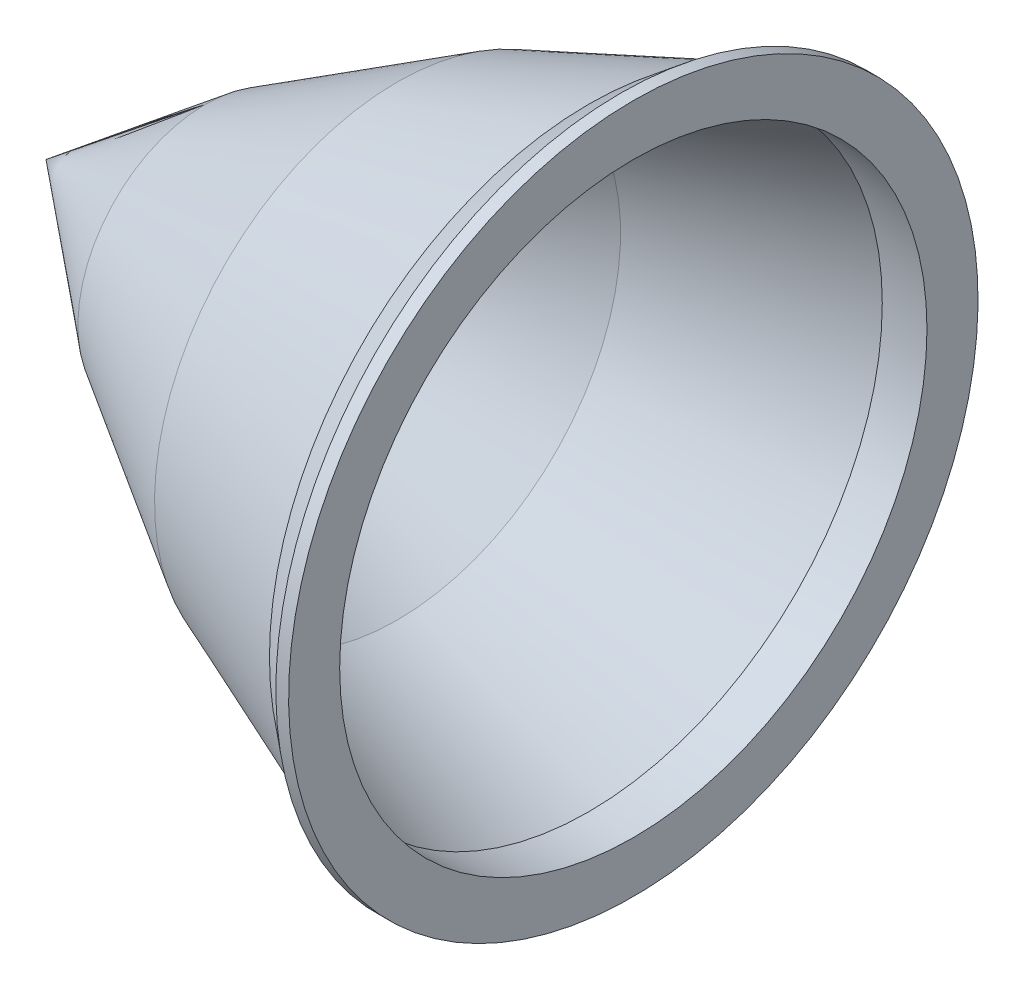
ISO-10303-21;
HEADER;
FILE_DESCRIPTION(('STEP AP214'),'2;1');
FILE_NAME('part.step','',(''),(''),'','','');
FILE_SCHEMA(('AUTOMOTIVE_DESIGN { 1 0 10303 214 1 1 1 1 }'));
ENDSEC;
DATA;
#1=APPLICATION_CONTEXT('core data for automotive mechanical design processes');
#2=APPLICATION_PROTOCOL_DEFINITION('international standard','automotive_design',2000,#1);
#3=PRODUCT_CONTEXT('',#1,'mechanical');
#4=PRODUCT('Part','Part','',(#3));
#5=PRODUCT_RELATED_PRODUCT_CATEGORY('part','',(#4));
#6=PRODUCT_DEFINITION_FORMATION('','',#4);
#7=PRODUCT_DEFINITION_CONTEXT('part definition',#1,'design');
#8=PRODUCT_DEFINITION('design','',#6,#7);
#9=PRODUCT_DEFINITION_SHAPE('','',#8);
#10=(LENGTH_UNIT() NAMED_UNIT(*) SI_UNIT(.MILLI.,.METRE.));
#11=(NAMED_UNIT(*) PLANE_ANGLE_UNIT() SI_UNIT($,.RADIAN.));
#12=(NAMED_UNIT(*) SI_UNIT($,.STERADIAN.) SOLID_ANGLE_UNIT());
#13=UNCERTAINTY_MEASURE_WITH_UNIT(LENGTH_MEASURE(1.E-05),#10,'distance_accuracy_value','');
#14=(GEOMETRIC_REPRESENTATION_CONTEXT(3) GLOBAL_UNCERTAINTY_ASSIGNED_CONTEXT((#13)) GLOBAL_UNIT_ASSIGNED_CONTEXT((#10,
#11,#12)) REPRESENTATION_CONTEXT('',''));
#15=CARTESIAN_POINT('',(0.,0.,0.));
#16=DIRECTION('',(0.,0.,1.));
#17=DIRECTION('',(1.,0.,0.));
#18=AXIS2_PLACEMENT_3D('',#15,#16,#17);
#19=CARTESIAN_POINT('',(50.,0.,0.));
#20=DIRECTION('',(1.,0.,0.));
#21=DIRECTION('',(0.,0.,-1.));
#22=AXIS2_PLACEMENT_3D('',#19,#20,#21);
#23=CONICAL_SURFACE('',#22,0.,0.704494064242218);
#24=CARTESIAN_POINT('',(250.,0.,0.));
#25=DIRECTION('',(-1.,0.,0.));
#26=DIRECTION('',(0.,0.,1.));
#27=AXIS2_PLACEMENT_3D('',#24,#25,#26);
#28=CIRCLE('',#27,170.);
#29=CARTESIAN_POINT('',(250.,170.,-1.22052963014615E-06));
#30=VERTEX_POINT('',#29);
#31=CARTESIAN_POINT('',(250.,170.,0.));
#32=VERTEX_POINT('',#31);
#33=EDGE_CURVE('E11',#30,#32,#28,.T.);
#34=ORIENTED_EDGE('',*,*,#33,.F.);
#35=DIRECTION('',(0.761939317759459,0.64764842009554,-4.64984756849381E-09));
#36=VECTOR('',#35,1.);
#37=CARTESIAN_POINT('',(250.,170.,-1.22052963014615E-06));
#38=LINE('',#37,#36);
#39=CARTESIAN_POINT('',(50.,0.,0.));
#40=VERTEX_POINT('',#39);
#41=EDGE_CURVE('E130',#40,#30,#38,.T.);
#42=ORIENTED_EDGE('',*,*,#41,.F.);
#43=DIRECTION('',(0.761939317759459,0.64764842009554,0.));
#44=VECTOR('',#43,1.);
#45=CARTESIAN_POINT('',(250.,170.,0.));
#46=LINE('',#45,#44);
#47=EDGE_CURVE('E128',#40,#32,#46,.T.);
#48=ORIENTED_EDGE('',*,*,#47,.T.);
#49=EDGE_LOOP('',(#34,#42,#48));
#50=FACE_BOUND('',#49,.T.);
#51=ADVANCED_FACE('F39',(#50),#23,.F.);
#52=CARTESIAN_POINT('',(250.,0.,0.));
#53=DIRECTION('',(1.,0.,0.));
#54=DIRECTION('',(0.,0.,-1.));
#55=AXIS2_PLACEMENT_3D('',#52,#53,#54);
#56=CONICAL_SURFACE('',#55,170.,0.540419500270584);
#57=CARTESIAN_POINT('',(550.,0.,0.));
#58=DIRECTION('',(-1.,0.,0.));
#59=DIRECTION('',(0.,0.,1.));
#60=AXIS2_PLACEMENT_3D('',#57,#58,#59);
#61=CIRCLE('',#60,350.);
#62=CARTESIAN_POINT('',(550.,350.,-2.51285512088913E-06));
#63=VERTEX_POINT('',#62);
#64=CARTESIAN_POINT('',(550.,350.,0.));
#65=VERTEX_POINT('',#64);
#66=EDGE_CURVE('E46',#63,#65,#61,.T.);
#67=ORIENTED_EDGE('',*,*,#66,.F.);
#68=DIRECTION('',(0.857492925712544,0.514495755427526,-3.69386655343366E-09));
#69=VECTOR('',#68,1.);
#70=CARTESIAN_POINT('',(550.,350.,-2.51285512088913E-06));
#71=LINE('',#70,#69);
#72=EDGE_CURVE('E122',#30,#63,#71,.T.);
#73=ORIENTED_EDGE('',*,*,#72,.F.);
#74=ORIENTED_EDGE('',*,*,#33,.T.);
#75=DIRECTION('',(0.857492925712544,0.514495755427526,0.));
#76=VECTOR('',#75,1.);
#77=CARTESIAN_POINT('',(550.,350.,0.));
#78=LINE('',#77,#76);
#79=EDGE_CURVE('E118',#32,#65,#78,.T.);
#80=ORIENTED_EDGE('',*,*,#79,.T.);
#81=EDGE_LOOP('',(#67,#73,#74,#80));
#82=FACE_BOUND('',#81,.T.);
#83=ADVANCED_FACE('F117',(#82),#56,.F.);
#84=CARTESIAN_POINT('',(550.,0.,0.));
#85=DIRECTION('',(1.,0.,0.));
#86=DIRECTION('',(0.,0.,-1.));
#87=AXIS2_PLACEMENT_3D('',#84,#85,#86);
#88=CONICAL_SURFACE('',#87,350.,0.351444794003552);
#89=CARTESIAN_POINT('',(850.,0.,0.));
#90=DIRECTION('',(-1.,0.,0.));
#91=DIRECTION('',(0.,0.,1.));
#92=AXIS2_PLACEMENT_3D('',#89,#90,#91);
#93=CIRCLE('',#92,460.);
#94=CARTESIAN_POINT('',(850.,460.,-3.30260958745428E-06));
#95=VERTEX_POINT('',#94);
#96=CARTESIAN_POINT('',(850.,460.,0.));
#97=VERTEX_POINT('',#96);
#98=EDGE_CURVE('E191',#95,#97,#93,.T.);
#99=ORIENTED_EDGE('',*,*,#98,.F.);
#100=DIRECTION('',(0.938876315886608,0.344254649158423,-2.47160588007895E-09));
#101=VECTOR('',#100,1.);
#102=CARTESIAN_POINT('',(850.,460.,-3.30260958745428E-06));
#103=LINE('',#102,#101);
#104=EDGE_CURVE('E158',#63,#95,#103,.T.);
#105=ORIENTED_EDGE('',*,*,#104,.F.);
#106=ORIENTED_EDGE('',*,*,#66,.T.);
#107=DIRECTION('',(0.938876315886608,0.344254649158423,0.));
#108=VECTOR('',#107,1.);
#109=CARTESIAN_POINT('',(850.,460.,0.));
#110=LINE('',#109,#108);
#111=EDGE_CURVE('E132',#65,#97,#110,.T.);
#112=ORIENTED_EDGE('',*,*,#111,.T.);
#113=EDGE_LOOP('',(#99,#105,#106,#112));
#114=FACE_BOUND('',#113,.T.);
#115=ADVANCED_FACE('F197',(#114),#88,.F.);
#116=CARTESIAN_POINT('',(0.,0.,0.));
#117=DIRECTION('',(-1.,0.,0.));
#118=DIRECTION('',(0.,0.,1.));
#119=AXIS2_PLACEMENT_3D('',#116,#117,#118);
#120=CYLINDRICAL_SURFACE('',#119,460.);
#121=CARTESIAN_POINT('',(920.,0.,0.));
#122=DIRECTION('',(-1.,0.,0.));
#123=DIRECTION('',(0.,0.,1.));
#124=AXIS2_PLACEMENT_3D('',#121,#122,#123);
#125=CIRCLE('',#124,460.);
#126=CARTESIAN_POINT('',(920.,460.,-3.30260958745428E-06));
#127=VERTEX_POINT('',#126);
#128=CARTESIAN_POINT('',(920.,460.,0.));
#129=VERTEX_POINT('',#128);
#130=EDGE_CURVE('E195',#127,#129,#125,.T.);
#131=ORIENTED_EDGE('',*,*,#130,.F.);
#132=DIRECTION('',(1.,0.,0.));
#133=VECTOR('',#132,1.);
#134=CARTESIAN_POINT('',(920.,460.,-3.30260958745428E-06));
#135=LINE('',#134,#133);
#136=EDGE_CURVE('E164',#95,#127,#135,.T.);
#137=ORIENTED_EDGE('',*,*,#136,.F.);
#138=ORIENTED_EDGE('',*,*,#98,.T.);
#139=DIRECTION('',(1.,0.,0.));
#140=VECTOR('',#139,1.);
#141=CARTESIAN_POINT('',(920.,460.,0.));
#142=LINE('',#141,#140);
#143=EDGE_CURVE('E136',#97,#129,#142,.T.);
#144=ORIENTED_EDGE('',*,*,#143,.T.);
#145=EDGE_LOOP('',(#131,#137,#138,#144));
#146=FACE_BOUND('',#145,.T.);
#147=ADVANCED_FACE('F217',(#146),#120,.F.);
#148=CARTESIAN_POINT('',(920.,540.,-3.87697647222894E-06));
#149=DIRECTION('',(-1.,0.,0.));
#150=DIRECTION('',(0.,0.,1.));
#151=AXIS2_PLACEMENT_3D('',#148,#149,#150);
#152=PLANE('',#151);
#153=CARTESIAN_POINT('',(920.,0.,0.));
#154=DIRECTION('',(-1.,0.,0.));
#155=DIRECTION('',(0.,0.,1.));
#156=AXIS2_PLACEMENT_3D('',#153,#154,#155);
#157=CIRCLE('',#156,540.);
#158=CARTESIAN_POINT('',(920.,540.,-3.87697647222894E-06));
#159=VERTEX_POINT('',#158);
#160=CARTESIAN_POINT('',(920.,540.,0.));
#161=VERTEX_POINT('',#160);
#162=EDGE_CURVE('E189',#159,#161,#157,.T.);
#163=ORIENTED_EDGE('',*,*,#162,.F.);
#164=DIRECTION('',(0.,1.,-7.17958605968322E-09));
#165=VECTOR('',#164,1.);
#166=CARTESIAN_POINT('',(920.,540.,-3.87697647222894E-06));
#167=LINE('',#166,#165);
#168=EDGE_CURVE('E168',#127,#159,#167,.T.);
#169=ORIENTED_EDGE('',*,*,#168,.F.);
#170=ORIENTED_EDGE('',*,*,#130,.T.);
#171=DIRECTION('',(0.,1.,0.));
#172=VECTOR('',#171,1.);
#173=CARTESIAN_POINT('',(920.,540.,0.));
#174=LINE('',#173,#172);
#175=EDGE_CURVE('E141',#129,#161,#174,.T.);
#176=ORIENTED_EDGE('',*,*,#175,.T.);
#177=EDGE_LOOP('',(#163,#169,#170,#176));
#178=FACE_BOUND('',#177,.T.);
#179=ADVANCED_FACE('F216',(#178),#152,.F.);
#180=CARTESIAN_POINT('',(0.,0.,0.));
#181=DIRECTION('',(-1.,0.,0.));
#182=DIRECTION('',(0.,0.,1.));
#183=AXIS2_PLACEMENT_3D('',#180,#181,#182);
#184=CYLINDRICAL_SURFACE('',#183,540.);
#185=CARTESIAN_POINT('',(900.,0.,0.));
#186=DIRECTION('',(-1.,0.,0.));
#187=DIRECTION('',(0.,0.,1.));
#188=AXIS2_PLACEMENT_3D('',#185,#186,#187);
#189=CIRCLE('',#188,540.);
#190=CARTESIAN_POINT('',(900.,540.,-3.87697647222894E-06));
#191=VERTEX_POINT('',#190);
#192=CARTESIAN_POINT('',(900.,540.,0.));
#193=VERTEX_POINT('',#192);
#194=EDGE_CURVE('E187',#191,#193,#189,.T.);
#195=ORIENTED_EDGE('',*,*,#194,.F.);
#196=DIRECTION('',(-1.,0.,0.));
#197=VECTOR('',#196,1.);
#198=CARTESIAN_POINT('',(900.,540.,-3.87697647222894E-06));
#199=LINE('',#198,#197);
#200=EDGE_CURVE('E170',#159,#191,#199,.T.);
#201=ORIENTED_EDGE('',*,*,#200,.F.);
#202=ORIENTED_EDGE('',*,*,#162,.T.);
#203=DIRECTION('',(-1.,0.,0.));
#204=VECTOR('',#203,1.);
#205=CARTESIAN_POINT('',(900.,540.,0.));
#206=LINE('',#205,#204);
#207=EDGE_CURVE('E143',#161,#193,#206,.T.);
#208=ORIENTED_EDGE('',*,*,#207,.T.);
#209=EDGE_LOOP('',(#195,#201,#202,#208));
#210=FACE_BOUND('',#209,.T.);
#211=ADVANCED_FACE('F215',(#210),#184,.T.);
#212=CARTESIAN_POINT('',(900.,0.,0.));
#213=DIRECTION('',(1.,0.,0.));
#214=DIRECTION('',(0.,0.,-1.));
#215=AXIS2_PLACEMENT_3D('',#212,#213,#214);
#216=CONICAL_SURFACE('',#215,540.,0.674740942223553);
#217=CARTESIAN_POINT('',(850.,0.,0.));
#218=DIRECTION('',(-1.,0.,0.));
#219=DIRECTION('',(0.,0.,1.));
#220=AXIS2_PLACEMENT_3D('',#217,#218,#219);
#221=CIRCLE('',#220,500.);
#222=CARTESIAN_POINT('',(850.,500.,-3.58979302984161E-06));
#223=VERTEX_POINT('',#222);
#224=CARTESIAN_POINT('',(850.,500.,0.));
#225=VERTEX_POINT('',#224);
#226=EDGE_CURVE('E186',#223,#225,#221,.T.);
#227=ORIENTED_EDGE('',*,*,#226,.F.);
#228=DIRECTION('',(-0.78086880944303,-0.624695047554424,4.48505185497489E-09));
#229=VECTOR('',#228,1.);
#230=CARTESIAN_POINT('',(850.,500.,-3.58979302984161E-06));
#231=LINE('',#230,#229);
#232=EDGE_CURVE('E175',#191,#223,#231,.T.);
#233=ORIENTED_EDGE('',*,*,#232,.F.);
#234=ORIENTED_EDGE('',*,*,#194,.T.);
#235=DIRECTION('',(-0.78086880944303,-0.624695047554424,0.));
#236=VECTOR('',#235,1.);
#237=CARTESIAN_POINT('',(850.,500.,0.));
#238=LINE('',#237,#236);
#239=EDGE_CURVE('E150',#193,#225,#238,.T.);
#240=ORIENTED_EDGE('',*,*,#239,.T.);
#241=EDGE_LOOP('',(#227,#233,#234,#240));
#242=FACE_BOUND('',#241,.T.);
#243=ADVANCED_FACE('F210',(#242),#216,.T.);
#244=CARTESIAN_POINT('',(850.,0.,0.));
#245=DIRECTION('',(1.,0.,0.));
#246=DIRECTION('',(0.,0.,-1.));
#247=AXIS2_PLACEMENT_3D('',#244,#245,#246);
#248=CONICAL_SURFACE('',#247,500.,0.380506377112365);
#249=CARTESIAN_POINT('',(550.,0.,0.));
#250=DIRECTION('',(-1.,0.,0.));
#251=DIRECTION('',(0.,0.,1.));
#252=AXIS2_PLACEMENT_3D('',#249,#250,#251);
#253=CIRCLE('',#252,380.);
#254=CARTESIAN_POINT('',(550.,380.,-2.72824270267963E-06));
#255=VERTEX_POINT('',#254);
#256=CARTESIAN_POINT('',(550.,380.,0.));
#257=VERTEX_POINT('',#256);
#258=EDGE_CURVE('E182',#255,#257,#253,.T.);
#259=ORIENTED_EDGE('',*,*,#258,.F.);
#260=DIRECTION('',(-0.928476690885259,-0.371390676354104,2.66643132264825E-09));
#261=VECTOR('',#260,1.);
#262=CARTESIAN_POINT('',(550.,380.,-2.72824270267963E-06));
#263=LINE('',#262,#261);
#264=EDGE_CURVE('E172',#223,#255,#263,.T.);
#265=ORIENTED_EDGE('',*,*,#264,.F.);
#266=ORIENTED_EDGE('',*,*,#226,.T.);
#267=DIRECTION('',(-0.928476690885259,-0.371390676354104,0.));
#268=VECTOR('',#267,1.);
#269=CARTESIAN_POINT('',(550.,380.,0.));
#270=LINE('',#269,#268);
#271=EDGE_CURVE('E148',#225,#257,#270,.T.);
#272=ORIENTED_EDGE('',*,*,#271,.T.);
#273=EDGE_LOOP('',(#259,#265,#266,#272));
#274=FACE_BOUND('',#273,.T.);
#275=ADVANCED_FACE('F207',(#274),#248,.T.);
#276=CARTESIAN_POINT('',(550.,0.,0.));
#277=DIRECTION('',(1.,0.,0.));
#278=DIRECTION('',(0.,0.,-1.));
#279=AXIS2_PLACEMENT_3D('',#276,#277,#278);
#280=CONICAL_SURFACE('',#279,380.,0.540419500270584);
#281=CARTESIAN_POINT('',(250.,0.,0.));
#282=DIRECTION('',(-1.,0.,0.));
#283=DIRECTION('',(0.,0.,1.));
#284=AXIS2_PLACEMENT_3D('',#281,#282,#283);
#285=CIRCLE('',#284,200.);
#286=CARTESIAN_POINT('',(250.,200.,-1.43591721193664E-06));
#287=VERTEX_POINT('',#286);
#288=CARTESIAN_POINT('',(250.,200.,0.));
#289=VERTEX_POINT('',#288);
#290=EDGE_CURVE('E58',#287,#289,#285,.T.);
#291=ORIENTED_EDGE('',*,*,#290,.F.);
#292=DIRECTION('',(-0.857492925712544,-0.514495755427526,3.69386655343366E-09));
#293=VECTOR('',#292,1.);
#294=CARTESIAN_POINT('',(250.,200.,-1.43591721193664E-06));
#295=LINE('',#294,#293);
#296=EDGE_CURVE('E178',#255,#287,#295,.T.);
#297=ORIENTED_EDGE('',*,*,#296,.F.);
#298=ORIENTED_EDGE('',*,*,#258,.T.);
#299=DIRECTION('',(-0.857492925712544,-0.514495755427526,0.));
#300=VECTOR('',#299,1.);
#301=CARTESIAN_POINT('',(250.,200.,0.));
#302=LINE('',#301,#300);
#303=EDGE_CURVE('E154',#257,#289,#302,.T.);
#304=ORIENTED_EDGE('',*,*,#303,.T.);
#305=EDGE_LOOP('',(#291,#297,#298,#304));
#306=FACE_BOUND('',#305,.T.);
#307=ADVANCED_FACE('F204',(#306),#280,.T.);
#308=CARTESIAN_POINT('',(250.,0.,0.));
#309=DIRECTION('',(1.,0.,0.));
#310=DIRECTION('',(0.,0.,-1.));
#311=AXIS2_PLACEMENT_3D('',#308,#309,#310);
#312=CONICAL_SURFACE('',#311,200.,0.674740942223553);
#313=DIRECTION('',(-0.78086880944303,-0.624695047554424,4.48505185497489E-09));
#314=VECTOR('',#313,1.);
#315=CARTESIAN_POINT('',(0.,0.,0.));
#316=LINE('',#315,#314);
#317=CARTESIAN_POINT('',(0.,0.,0.));
#318=VERTEX_POINT('',#317);
#319=EDGE_CURVE('E179',#287,#318,#316,.T.);
#320=ORIENTED_EDGE('',*,*,#319,.F.);
#321=ORIENTED_EDGE('',*,*,#290,.T.);
#322=DIRECTION('',(-0.78086880944303,-0.624695047554424,0.));
#323=VECTOR('',#322,1.);
#324=CARTESIAN_POINT('',(0.,0.,0.));
#325=LINE('',#324,#323);
#326=EDGE_CURVE('E52',#289,#318,#325,.T.);
#327=ORIENTED_EDGE('',*,*,#326,.T.);
#328=EDGE_LOOP('',(#320,#321,#327));
#329=FACE_BOUND('',#328,.T.);
#330=ADVANCED_FACE('F221',(#329),#312,.T.);
#331=CARTESIAN_POINT('',(0.,0.,0.));
#332=DIRECTION('',(0.,7.17958605968322E-09,1.));
#333=DIRECTION('',(1.,0.,0.));
#334=AXIS2_PLACEMENT_3D('',#331,#332,#333);
#335=PLANE('',#334);
#336=DIRECTION('',(1.,0.,0.));
#337=VECTOR('',#336,1.);
#338=CARTESIAN_POINT('',(50.,0.,0.));
#339=LINE('',#338,#337);
#340=EDGE_CURVE('E157',#318,#40,#339,.T.);
#341=ORIENTED_EDGE('',*,*,#340,.T.);
#342=ORIENTED_EDGE('',*,*,#41,.T.);
#343=ORIENTED_EDGE('',*,*,#72,.T.);
#344=ORIENTED_EDGE('',*,*,#104,.T.);
#345=ORIENTED_EDGE('',*,*,#136,.T.);
#346=ORIENTED_EDGE('',*,*,#168,.T.);
#347=ORIENTED_EDGE('',*,*,#200,.T.);
#348=ORIENTED_EDGE('',*,*,#232,.T.);
#349=ORIENTED_EDGE('',*,*,#264,.T.);
#350=ORIENTED_EDGE('',*,*,#296,.T.);
#351=ORIENTED_EDGE('',*,*,#319,.T.);
#352=EDGE_LOOP('',(#341,#342,#343,#344,#345,#346,#347,#348,#349,#350,#351));
#353=FACE_BOUND('',#352,.T.);
#354=ADVANCED_FACE('F198',(#353),#335,.T.);
#355=CARTESIAN_POINT('',(0.,0.,0.));
#356=DIRECTION('',(0.,0.,1.));
#357=DIRECTION('',(1.,0.,0.));
#358=AXIS2_PLACEMENT_3D('',#355,#356,#357);
#359=PLANE('',#358);
#360=ORIENTED_EDGE('',*,*,#340,.F.);
#361=ORIENTED_EDGE('',*,*,#326,.F.);
#362=ORIENTED_EDGE('',*,*,#303,.F.);
#363=ORIENTED_EDGE('',*,*,#271,.F.);
#364=ORIENTED_EDGE('',*,*,#239,.F.);
#365=ORIENTED_EDGE('',*,*,#207,.F.);
#366=ORIENTED_EDGE('',*,*,#175,.F.);
#367=ORIENTED_EDGE('',*,*,#143,.F.);
#368=ORIENTED_EDGE('',*,*,#111,.F.);
#369=ORIENTED_EDGE('',*,*,#79,.F.);
#370=ORIENTED_EDGE('',*,*,#47,.F.);
#371=EDGE_LOOP('',(#360,#361,#362,#363,#364,#365,#366,#367,#368,#369,#370));
#372=FACE_BOUND('',#371,.T.);
#373=ADVANCED_FACE('F131',(#372),#359,.F.);
#374=CLOSED_SHELL('',(#51,#83,#115,#147,#179,#211,#243,#275,#307,#330,#354,#373));
#375=MANIFOLD_SOLID_BREP('B2',#374);
#376=ADVANCED_BREP_SHAPE_REPRESENTATION('',(#18,#375),#14);
#377=SHAPE_DEFINITION_REPRESENTATION(#9,#376);
ENDSEC;
END-ISO-10303-21;
